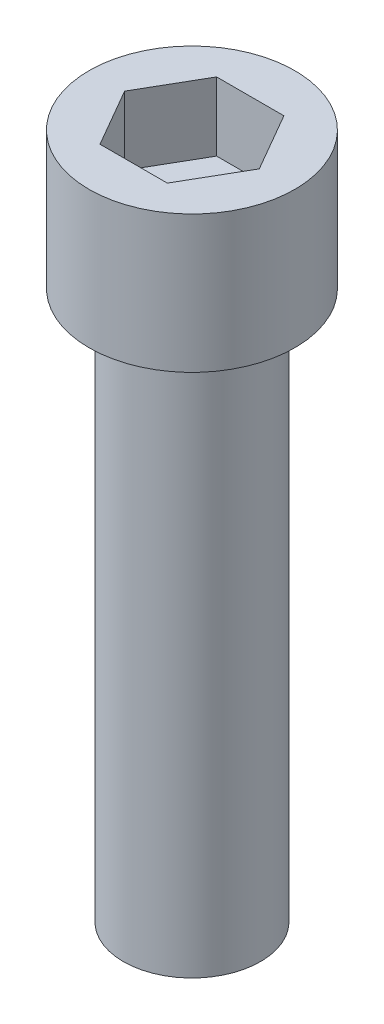
ISO-10303-21;
HEADER;
FILE_DESCRIPTION(('STEP AP214'),'2;1');
FILE_NAME('part.step','',(''),(''),'','','');
FILE_SCHEMA(('AUTOMOTIVE_DESIGN { 1 0 10303 214 1 1 1 1 }'));
ENDSEC;
DATA;
#1=APPLICATION_CONTEXT('core data for automotive mechanical design processes');
#2=APPLICATION_PROTOCOL_DEFINITION('international standard','automotive_design',2000,#1);
#3=PRODUCT_CONTEXT('',#1,'mechanical');
#4=PRODUCT('Part','Part','',(#3));
#5=PRODUCT_RELATED_PRODUCT_CATEGORY('part','',(#4));
#6=PRODUCT_DEFINITION_FORMATION('','',#4);
#7=PRODUCT_DEFINITION_CONTEXT('part definition',#1,'design');
#8=PRODUCT_DEFINITION('design','',#6,#7);
#9=PRODUCT_DEFINITION_SHAPE('','',#8);
#10=(LENGTH_UNIT() NAMED_UNIT(*) SI_UNIT(.MILLI.,.METRE.));
#11=(NAMED_UNIT(*) PLANE_ANGLE_UNIT() SI_UNIT($,.RADIAN.));
#12=(NAMED_UNIT(*) SI_UNIT($,.STERADIAN.) SOLID_ANGLE_UNIT());
#13=UNCERTAINTY_MEASURE_WITH_UNIT(LENGTH_MEASURE(1.E-05),#10,'distance_accuracy_value','');
#14=(GEOMETRIC_REPRESENTATION_CONTEXT(3) GLOBAL_UNCERTAINTY_ASSIGNED_CONTEXT((#13)) GLOBAL_UNIT_ASSIGNED_CONTEXT((#10,
#11,#12)) REPRESENTATION_CONTEXT('',''));
#15=CARTESIAN_POINT('',(0.,0.,0.));
#16=DIRECTION('',(0.,0.,1.));
#17=DIRECTION('',(1.,0.,0.));
#18=AXIS2_PLACEMENT_3D('',#15,#16,#17);
#19=CARTESIAN_POINT('',(0.,-80.,0.));
#20=DIRECTION('',(0.,1.,0.));
#21=DIRECTION('',(0.,0.,1.));
#22=AXIS2_PLACEMENT_3D('',#19,#20,#21);
#23=PLANE('',#22);
#24=CARTESIAN_POINT('',(0.,-80.,0.));
#25=DIRECTION('',(0.,1.,0.));
#26=DIRECTION('',(0.,0.,1.));
#27=AXIS2_PLACEMENT_3D('',#24,#25,#26);
#28=CIRCLE('',#27,10.);
#29=CARTESIAN_POINT('',(0.,-80.,10.));
#30=VERTEX_POINT('',#29);
#31=EDGE_CURVE('E11',#30,#30,#28,.T.);
#32=ORIENTED_EDGE('',*,*,#31,.F.);
#33=EDGE_LOOP('',(#32));
#34=FACE_BOUND('',#33,.T.);
#35=ADVANCED_FACE('F34',(#34),#23,.F.);
#36=CARTESIAN_POINT('',(0.,61.6916426261037,0.));
#37=DIRECTION('',(0.,1.,0.));
#38=DIRECTION('',(0.,0.,1.));
#39=AXIS2_PLACEMENT_3D('',#36,#37,#38);
#40=CYLINDRICAL_SURFACE('',#39,10.);
#41=CARTESIAN_POINT('',(0.,0.,0.));
#42=DIRECTION('',(0.,1.,0.));
#43=DIRECTION('',(0.,0.,1.));
#44=AXIS2_PLACEMENT_3D('',#41,#42,#43);
#45=CIRCLE('',#44,10.);
#46=CARTESIAN_POINT('',(0.,0.,10.));
#47=VERTEX_POINT('',#46);
#48=EDGE_CURVE('E41',#47,#47,#45,.T.);
#49=ORIENTED_EDGE('',*,*,#48,.F.);
#50=EDGE_LOOP('',(#49));
#51=FACE_BOUND('',#50,.T.);
#52=ORIENTED_EDGE('',*,*,#31,.T.);
#53=EDGE_LOOP('',(#52));
#54=FACE_BOUND('',#53,.T.);
#55=ADVANCED_FACE('F150',(#51,#54),#40,.T.);
#56=CARTESIAN_POINT('',(10.,0.,0.));
#57=DIRECTION('',(0.,1.,0.));
#58=DIRECTION('',(0.,0.,1.));
#59=AXIS2_PLACEMENT_3D('',#56,#57,#58);
#60=PLANE('',#59);
#61=CARTESIAN_POINT('',(0.,0.,0.));
#62=DIRECTION('',(0.,1.,0.));
#63=DIRECTION('',(0.,0.,1.));
#64=AXIS2_PLACEMENT_3D('',#61,#62,#63);
#65=CIRCLE('',#64,15.);
#66=CARTESIAN_POINT('',(0.,0.,15.));
#67=VERTEX_POINT('',#66);
#68=EDGE_CURVE('E143',#67,#67,#65,.T.);
#69=ORIENTED_EDGE('',*,*,#68,.F.);
#70=EDGE_LOOP('',(#69));
#71=FACE_BOUND('',#70,.T.);
#72=ORIENTED_EDGE('',*,*,#48,.T.);
#73=EDGE_LOOP('',(#72));
#74=FACE_BOUND('',#73,.T.);
#75=ADVANCED_FACE('F148',(#71,#74),#60,.F.);
#76=CARTESIAN_POINT('',(0.,61.6916426261037,0.));
#77=DIRECTION('',(0.,1.,0.));
#78=DIRECTION('',(0.,0.,1.));
#79=AXIS2_PLACEMENT_3D('',#76,#77,#78);
#80=CYLINDRICAL_SURFACE('',#79,15.);
#81=CARTESIAN_POINT('',(0.,20.,0.));
#82=DIRECTION('',(0.,1.,0.));
#83=DIRECTION('',(0.,0.,1.));
#84=AXIS2_PLACEMENT_3D('',#81,#82,#83);
#85=CIRCLE('',#84,15.);
#86=CARTESIAN_POINT('',(0.,20.,15.));
#87=VERTEX_POINT('',#86);
#88=EDGE_CURVE('E135',#87,#87,#85,.T.);
#89=ORIENTED_EDGE('',*,*,#88,.F.);
#90=EDGE_LOOP('',(#89));
#91=FACE_BOUND('',#90,.T.);
#92=ORIENTED_EDGE('',*,*,#68,.T.);
#93=EDGE_LOOP('',(#92));
#94=FACE_BOUND('',#93,.T.);
#95=ADVANCED_FACE('F168',(#91,#94),#80,.T.);
#96=CARTESIAN_POINT('',(15.,20.,0.));
#97=DIRECTION('',(0.,-1.,0.));
#98=DIRECTION('',(0.,0.,-1.));
#99=AXIS2_PLACEMENT_3D('',#96,#97,#98);
#100=PLANE('',#99);
#101=DIRECTION('',(-1.,0.,0.));
#102=VECTOR('',#101,1.);
#103=CARTESIAN_POINT('',(4.90747728811182,20.,-8.5));
#104=LINE('',#103,#102);
#105=CARTESIAN_POINT('',(4.90747728811182,20.,-8.5));
#106=VERTEX_POINT('',#105);
#107=CARTESIAN_POINT('',(-4.90747728811182,20.,-8.5));
#108=VERTEX_POINT('',#107);
#109=EDGE_CURVE('E122',#106,#108,#104,.T.);
#110=ORIENTED_EDGE('',*,*,#109,.F.);
#111=DIRECTION('',(-0.5,0.,-0.866025403784439));
#112=VECTOR('',#111,1.);
#113=CARTESIAN_POINT('',(9.81495457622364,20.,0.));
#114=LINE('',#113,#112);
#115=CARTESIAN_POINT('',(9.81495457622364,20.,0.));
#116=VERTEX_POINT('',#115);
#117=EDGE_CURVE('E48',#116,#106,#114,.T.);
#118=ORIENTED_EDGE('',*,*,#117,.F.);
#119=DIRECTION('',(0.5,0.,-0.866025403784438));
#120=VECTOR('',#119,1.);
#121=CARTESIAN_POINT('',(4.90747728811182,20.,8.5));
#122=LINE('',#121,#120);
#123=CARTESIAN_POINT('',(4.90747728811182,20.,8.5));
#124=VERTEX_POINT('',#123);
#125=EDGE_CURVE('E131',#124,#116,#122,.T.);
#126=ORIENTED_EDGE('',*,*,#125,.F.);
#127=DIRECTION('',(1.,0.,0.));
#128=VECTOR('',#127,1.);
#129=CARTESIAN_POINT('',(-4.90747728811182,20.,8.5));
#130=LINE('',#129,#128);
#131=CARTESIAN_POINT('',(-4.90747728811182,20.,8.5));
#132=VERTEX_POINT('',#131);
#133=EDGE_CURVE('E129',#132,#124,#130,.T.);
#134=ORIENTED_EDGE('',*,*,#133,.F.);
#135=DIRECTION('',(0.5,0.,0.866025403784438));
#136=VECTOR('',#135,1.);
#137=CARTESIAN_POINT('',(-9.81495457622364,20.,0.));
#138=LINE('',#137,#136);
#139=CARTESIAN_POINT('',(-9.81495457622364,20.,0.));
#140=VERTEX_POINT('',#139);
#141=EDGE_CURVE('E96',#140,#132,#138,.T.);
#142=ORIENTED_EDGE('',*,*,#141,.F.);
#143=DIRECTION('',(-0.5,0.,0.866025403784439));
#144=VECTOR('',#143,1.);
#145=CARTESIAN_POINT('',(-4.90747728811182,20.,-8.5));
#146=LINE('',#145,#144);
#147=EDGE_CURVE('E125',#108,#140,#146,.T.);
#148=ORIENTED_EDGE('',*,*,#147,.F.);
#149=EDGE_LOOP('',(#110,#118,#126,#134,#142,#148));
#150=FACE_BOUND('',#149,.T.);
#151=ORIENTED_EDGE('',*,*,#88,.T.);
#152=EDGE_LOOP('',(#151));
#153=FACE_BOUND('',#152,.T.);
#154=ADVANCED_FACE('F176',(#150,#153),#100,.F.);
#155=CARTESIAN_POINT('',(9.81495457622364,10.,0.));
#156=DIRECTION('',(0.866025403784439,0.,-0.5));
#157=DIRECTION('',(-0.5,0.,-0.866025403784439));
#158=AXIS2_PLACEMENT_3D('',#155,#156,#157);
#159=PLANE('',#158);
#160=ORIENTED_EDGE('',*,*,#117,.T.);
#161=DIRECTION('',(0.,1.,0.));
#162=VECTOR('',#161,1.);
#163=CARTESIAN_POINT('',(4.90747728811182,10.,-8.5));
#164=LINE('',#163,#162);
#165=CARTESIAN_POINT('',(4.90747728811182,10.,-8.5));
#166=VERTEX_POINT('',#165);
#167=EDGE_CURVE('E78',#166,#106,#164,.T.);
#168=ORIENTED_EDGE('',*,*,#167,.F.);
#169=DIRECTION('',(-0.5,0.,-0.866025403784439));
#170=VECTOR('',#169,1.);
#171=CARTESIAN_POINT('',(9.81495457622364,10.,0.));
#172=LINE('',#171,#170);
#173=CARTESIAN_POINT('',(9.81495457622364,10.,0.));
#174=VERTEX_POINT('',#173);
#175=EDGE_CURVE('E133',#174,#166,#172,.T.);
#176=ORIENTED_EDGE('',*,*,#175,.F.);
#177=DIRECTION('',(0.,1.,0.));
#178=VECTOR('',#177,1.);
#179=CARTESIAN_POINT('',(9.81495457622364,10.,0.));
#180=LINE('',#179,#178);
#181=EDGE_CURVE('E56',#174,#116,#180,.T.);
#182=ORIENTED_EDGE('',*,*,#181,.T.);
#183=EDGE_LOOP('',(#160,#168,#176,#182));
#184=FACE_BOUND('',#183,.T.);
#185=ADVANCED_FACE('F184',(#184),#159,.F.);
#186=CARTESIAN_POINT('',(4.90747728811182,10.,8.5));
#187=DIRECTION('',(0.866025403784439,0.,0.5));
#188=DIRECTION('',(0.5,0.,-0.866025403784439));
#189=AXIS2_PLACEMENT_3D('',#186,#187,#188);
#190=PLANE('',#189);
#191=ORIENTED_EDGE('',*,*,#125,.T.);
#192=ORIENTED_EDGE('',*,*,#181,.F.);
#193=DIRECTION('',(0.5,0.,-0.866025403784438));
#194=VECTOR('',#193,1.);
#195=CARTESIAN_POINT('',(4.90747728811182,10.,8.5));
#196=LINE('',#195,#194);
#197=CARTESIAN_POINT('',(4.90747728811182,10.,8.5));
#198=VERTEX_POINT('',#197);
#199=EDGE_CURVE('E108',#198,#174,#196,.T.);
#200=ORIENTED_EDGE('',*,*,#199,.F.);
#201=DIRECTION('',(0.,1.,0.));
#202=VECTOR('',#201,1.);
#203=CARTESIAN_POINT('',(4.90747728811182,10.,8.5));
#204=LINE('',#203,#202);
#205=EDGE_CURVE('E100',#198,#124,#204,.T.);
#206=ORIENTED_EDGE('',*,*,#205,.T.);
#207=EDGE_LOOP('',(#191,#192,#200,#206));
#208=FACE_BOUND('',#207,.T.);
#209=ADVANCED_FACE('F192',(#208),#190,.F.);
#210=CARTESIAN_POINT('',(-4.90747728811182,10.,8.5));
#211=DIRECTION('',(0.,0.,1.));
#212=DIRECTION('',(1.,0.,0.));
#213=AXIS2_PLACEMENT_3D('',#210,#211,#212);
#214=PLANE('',#213);
#215=ORIENTED_EDGE('',*,*,#133,.T.);
#216=ORIENTED_EDGE('',*,*,#205,.F.);
#217=DIRECTION('',(1.,0.,0.));
#218=VECTOR('',#217,1.);
#219=CARTESIAN_POINT('',(-4.90747728811182,10.,8.5));
#220=LINE('',#219,#218);
#221=CARTESIAN_POINT('',(-4.90747728811182,10.,8.5));
#222=VERTEX_POINT('',#221);
#223=EDGE_CURVE('E104',#222,#198,#220,.T.);
#224=ORIENTED_EDGE('',*,*,#223,.F.);
#225=DIRECTION('',(0.,1.,0.));
#226=VECTOR('',#225,1.);
#227=CARTESIAN_POINT('',(-4.90747728811182,10.,8.5));
#228=LINE('',#227,#226);
#229=EDGE_CURVE('E89',#222,#132,#228,.T.);
#230=ORIENTED_EDGE('',*,*,#229,.T.);
#231=EDGE_LOOP('',(#215,#216,#224,#230));
#232=FACE_BOUND('',#231,.T.);
#233=ADVANCED_FACE('F105',(#232),#214,.F.);
#234=CARTESIAN_POINT('',(-9.81495457622364,10.,0.));
#235=DIRECTION('',(-0.866025403784438,0.,0.5));
#236=DIRECTION('',(0.5,0.,0.866025403784439));
#237=AXIS2_PLACEMENT_3D('',#234,#235,#236);
#238=PLANE('',#237);
#239=ORIENTED_EDGE('',*,*,#141,.T.);
#240=ORIENTED_EDGE('',*,*,#229,.F.);
#241=DIRECTION('',(0.5,0.,0.866025403784438));
#242=VECTOR('',#241,1.);
#243=CARTESIAN_POINT('',(-9.81495457622364,10.,0.));
#244=LINE('',#243,#242);
#245=CARTESIAN_POINT('',(-9.81495457622364,10.,0.));
#246=VERTEX_POINT('',#245);
#247=EDGE_CURVE('E93',#246,#222,#244,.T.);
#248=ORIENTED_EDGE('',*,*,#247,.F.);
#249=DIRECTION('',(0.,1.,0.));
#250=VECTOR('',#249,1.);
#251=CARTESIAN_POINT('',(-9.81495457622364,10.,0.));
#252=LINE('',#251,#250);
#253=EDGE_CURVE('E101',#246,#140,#252,.T.);
#254=ORIENTED_EDGE('',*,*,#253,.T.);
#255=EDGE_LOOP('',(#239,#240,#248,#254));
#256=FACE_BOUND('',#255,.T.);
#257=ADVANCED_FACE('F91',(#256),#238,.F.);
#258=CARTESIAN_POINT('',(-4.90747728811182,10.,-8.5));
#259=DIRECTION('',(-0.866025403784439,0.,-0.5));
#260=DIRECTION('',(-0.5,0.,0.866025403784439));
#261=AXIS2_PLACEMENT_3D('',#258,#259,#260);
#262=PLANE('',#261);
#263=ORIENTED_EDGE('',*,*,#147,.T.);
#264=ORIENTED_EDGE('',*,*,#253,.F.);
#265=DIRECTION('',(-0.5,0.,0.866025403784439));
#266=VECTOR('',#265,1.);
#267=CARTESIAN_POINT('',(-4.90747728811182,10.,-8.5));
#268=LINE('',#267,#266);
#269=CARTESIAN_POINT('',(-4.90747728811182,10.,-8.5));
#270=VERTEX_POINT('',#269);
#271=EDGE_CURVE('E114',#270,#246,#268,.T.);
#272=ORIENTED_EDGE('',*,*,#271,.F.);
#273=DIRECTION('',(0.,1.,0.));
#274=VECTOR('',#273,1.);
#275=CARTESIAN_POINT('',(-4.90747728811182,10.,-8.5));
#276=LINE('',#275,#274);
#277=EDGE_CURVE('E138',#270,#108,#276,.T.);
#278=ORIENTED_EDGE('',*,*,#277,.T.);
#279=EDGE_LOOP('',(#263,#264,#272,#278));
#280=FACE_BOUND('',#279,.T.);
#281=ADVANCED_FACE('F211',(#280),#262,.F.);
#282=CARTESIAN_POINT('',(4.90747728811182,10.,-8.5));
#283=DIRECTION('',(0.,0.,-1.));
#284=DIRECTION('',(-1.,0.,0.));
#285=AXIS2_PLACEMENT_3D('',#282,#283,#284);
#286=PLANE('',#285);
#287=ORIENTED_EDGE('',*,*,#109,.T.);
#288=ORIENTED_EDGE('',*,*,#277,.F.);
#289=DIRECTION('',(-1.,0.,0.));
#290=VECTOR('',#289,1.);
#291=CARTESIAN_POINT('',(4.90747728811182,10.,-8.5));
#292=LINE('',#291,#290);
#293=EDGE_CURVE('E116',#166,#270,#292,.T.);
#294=ORIENTED_EDGE('',*,*,#293,.F.);
#295=ORIENTED_EDGE('',*,*,#167,.T.);
#296=EDGE_LOOP('',(#287,#288,#294,#295));
#297=FACE_BOUND('',#296,.T.);
#298=ADVANCED_FACE('F218',(#297),#286,.F.);
#299=CARTESIAN_POINT('',(9.81495457622364,10.,0.));
#300=DIRECTION('',(0.,-1.,0.));
#301=DIRECTION('',(0.,0.,-1.));
#302=AXIS2_PLACEMENT_3D('',#299,#300,#301);
#303=PLANE('',#302);
#304=ORIENTED_EDGE('',*,*,#175,.T.);
#305=ORIENTED_EDGE('',*,*,#293,.T.);
#306=ORIENTED_EDGE('',*,*,#271,.T.);
#307=ORIENTED_EDGE('',*,*,#247,.T.);
#308=ORIENTED_EDGE('',*,*,#223,.T.);
#309=ORIENTED_EDGE('',*,*,#199,.T.);
#310=EDGE_LOOP('',(#304,#305,#306,#307,#308,#309));
#311=FACE_BOUND('',#310,.T.);
#312=ADVANCED_FACE('F111',(#311),#303,.F.);
#313=CLOSED_SHELL('',(#35,#55,#75,#95,#154,#185,#209,#233,#257,#281,#298,#312));
#314=MANIFOLD_SOLID_BREP('B2',#313);
#315=ADVANCED_BREP_SHAPE_REPRESENTATION('',(#18,#314),#14);
#316=SHAPE_DEFINITION_REPRESENTATION(#9,#315);
ENDSEC;
END-ISO-10303-21;
